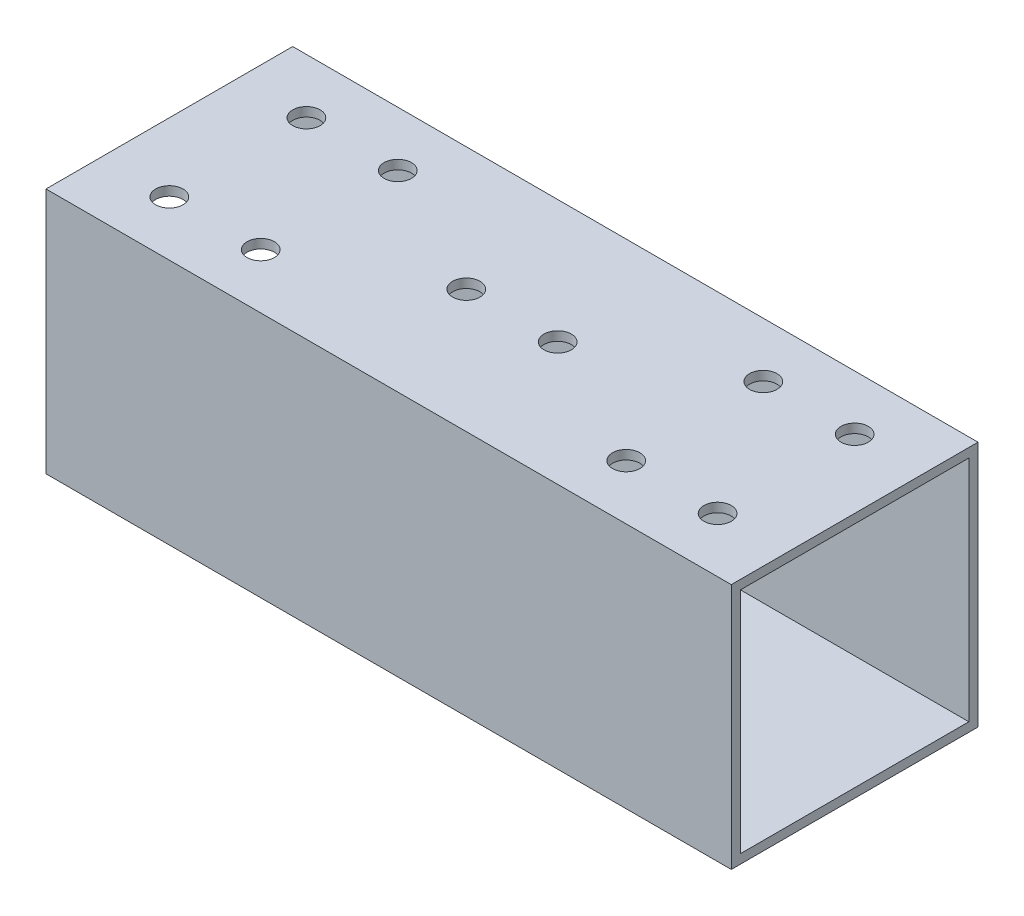
ISO-10303-21;
HEADER;
FILE_DESCRIPTION(('STEP AP214'),'2;1');
FILE_NAME('part.step','',(''),(''),'','','');
FILE_SCHEMA(('AUTOMOTIVE_DESIGN { 1 0 10303 214 1 1 1 1 }'));
ENDSEC;
DATA;
#1=APPLICATION_CONTEXT('core data for automotive mechanical design processes');
#2=APPLICATION_PROTOCOL_DEFINITION('international standard','automotive_design',2000,#1);
#3=PRODUCT_CONTEXT('',#1,'mechanical');
#4=PRODUCT('Part','Part','',(#3));
#5=PRODUCT_RELATED_PRODUCT_CATEGORY('part','',(#4));
#6=PRODUCT_DEFINITION_FORMATION('','',#4);
#7=PRODUCT_DEFINITION_CONTEXT('part definition',#1,'design');
#8=PRODUCT_DEFINITION('design','',#6,#7);
#9=PRODUCT_DEFINITION_SHAPE('','',#8);
#10=(LENGTH_UNIT() NAMED_UNIT(*) SI_UNIT(.MILLI.,.METRE.));
#11=(NAMED_UNIT(*) PLANE_ANGLE_UNIT() SI_UNIT($,.RADIAN.));
#12=(NAMED_UNIT(*) SI_UNIT($,.STERADIAN.) SOLID_ANGLE_UNIT());
#13=UNCERTAINTY_MEASURE_WITH_UNIT(LENGTH_MEASURE(1.E-05),#10,'distance_accuracy_value','');
#14=(GEOMETRIC_REPRESENTATION_CONTEXT(3) GLOBAL_UNCERTAINTY_ASSIGNED_CONTEXT((#13)) GLOBAL_UNIT_ASSIGNED_CONTEXT((#10,
#11,#12)) REPRESENTATION_CONTEXT('',''));
#15=CARTESIAN_POINT('',(0.,0.,0.));
#16=DIRECTION('',(0.,0.,1.));
#17=DIRECTION('',(1.,0.,0.));
#18=AXIS2_PLACEMENT_3D('',#15,#16,#17);
#19=CARTESIAN_POINT('',(75.,0.,0.));
#20=DIRECTION('',(1.,0.,0.));
#21=DIRECTION('',(0.,0.,-1.));
#22=AXIS2_PLACEMENT_3D('',#19,#20,#21);
#23=PLANE('',#22);
#24=DIRECTION('',(0.,-1.,0.));
#25=VECTOR('',#24,1.);
#26=CARTESIAN_POINT('',(75.,-27.,27.));
#27=LINE('',#26,#25);
#28=CARTESIAN_POINT('',(75.,27.,27.));
#29=VERTEX_POINT('',#28);
#30=CARTESIAN_POINT('',(75.,-27.,27.));
#31=VERTEX_POINT('',#30);
#32=EDGE_CURVE('E138',#29,#31,#27,.T.);
#33=ORIENTED_EDGE('',*,*,#32,.T.);
#34=DIRECTION('',(0.,0.,-1.));
#35=VECTOR('',#34,1.);
#36=CARTESIAN_POINT('',(75.,-27.,-27.));
#37=LINE('',#36,#35);
#38=CARTESIAN_POINT('',(75.,-27.,-27.));
#39=VERTEX_POINT('',#38);
#40=EDGE_CURVE('E141',#31,#39,#37,.T.);
#41=ORIENTED_EDGE('',*,*,#40,.T.);
#42=DIRECTION('',(0.,1.,0.));
#43=VECTOR('',#42,1.);
#44=CARTESIAN_POINT('',(75.,-27.,-27.));
#45=LINE('',#44,#43);
#46=CARTESIAN_POINT('',(75.,27.,-27.));
#47=VERTEX_POINT('',#46);
#48=EDGE_CURVE('E144',#39,#47,#45,.T.);
#49=ORIENTED_EDGE('',*,*,#48,.T.);
#50=DIRECTION('',(0.,0.,1.));
#51=VECTOR('',#50,1.);
#52=CARTESIAN_POINT('',(75.,27.,-27.));
#53=LINE('',#52,#51);
#54=EDGE_CURVE('E146',#47,#29,#53,.T.);
#55=ORIENTED_EDGE('',*,*,#54,.T.);
#56=EDGE_LOOP('',(#33,#41,#49,#55));
#57=FACE_BOUND('',#56,.T.);
#58=DIRECTION('',(0.,0.,1.));
#59=VECTOR('',#58,1.);
#60=CARTESIAN_POINT('',(75.,25.,25.));
#61=LINE('',#60,#59);
#62=CARTESIAN_POINT('',(75.,25.,-25.));
#63=VERTEX_POINT('',#62);
#64=CARTESIAN_POINT('',(75.,25.,25.));
#65=VERTEX_POINT('',#64);
#66=EDGE_CURVE('E108',#63,#65,#61,.T.);
#67=ORIENTED_EDGE('',*,*,#66,.F.);
#68=DIRECTION('',(0.,1.,0.));
#69=VECTOR('',#68,1.);
#70=CARTESIAN_POINT('',(75.,-25.,-25.));
#71=LINE('',#70,#69);
#72=CARTESIAN_POINT('',(75.,-25.,-25.));
#73=VERTEX_POINT('',#72);
#74=EDGE_CURVE('E100',#73,#63,#71,.T.);
#75=ORIENTED_EDGE('',*,*,#74,.F.);
#76=DIRECTION('',(0.,0.,-1.));
#77=VECTOR('',#76,1.);
#78=CARTESIAN_POINT('',(75.,-25.,25.));
#79=LINE('',#78,#77);
#80=CARTESIAN_POINT('',(75.,-25.,25.));
#81=VERTEX_POINT('',#80);
#82=EDGE_CURVE('E122',#81,#73,#79,.T.);
#83=ORIENTED_EDGE('',*,*,#82,.F.);
#84=DIRECTION('',(0.,-1.,0.));
#85=VECTOR('',#84,1.);
#86=CARTESIAN_POINT('',(75.,-25.,25.));
#87=LINE('',#86,#85);
#88=EDGE_CURVE('E120',#65,#81,#87,.T.);
#89=ORIENTED_EDGE('',*,*,#88,.F.);
#90=EDGE_LOOP('',(#67,#75,#83,#89));
#91=FACE_BOUND('',#90,.T.);
#92=ADVANCED_FACE('F33',(#57,#91),#23,.T.);
#93=CARTESIAN_POINT('',(-75.,0.,0.));
#94=DIRECTION('',(1.,0.,0.));
#95=DIRECTION('',(0.,0.,-1.));
#96=AXIS2_PLACEMENT_3D('',#93,#94,#95);
#97=PLANE('',#96);
#98=DIRECTION('',(0.,-1.,0.));
#99=VECTOR('',#98,1.);
#100=CARTESIAN_POINT('',(-75.,-27.,27.));
#101=LINE('',#100,#99);
#102=CARTESIAN_POINT('',(-75.,27.,27.));
#103=VERTEX_POINT('',#102);
#104=CARTESIAN_POINT('',(-75.,-27.,27.));
#105=VERTEX_POINT('',#104);
#106=EDGE_CURVE('E116',#103,#105,#101,.T.);
#107=ORIENTED_EDGE('',*,*,#106,.F.);
#108=DIRECTION('',(0.,0.,1.));
#109=VECTOR('',#108,1.);
#110=CARTESIAN_POINT('',(-75.,27.,-27.));
#111=LINE('',#110,#109);
#112=CARTESIAN_POINT('',(-75.,27.,-27.));
#113=VERTEX_POINT('',#112);
#114=EDGE_CURVE('E142',#113,#103,#111,.T.);
#115=ORIENTED_EDGE('',*,*,#114,.F.);
#116=DIRECTION('',(0.,1.,0.));
#117=VECTOR('',#116,1.);
#118=CARTESIAN_POINT('',(-75.,-27.,-27.));
#119=LINE('',#118,#117);
#120=CARTESIAN_POINT('',(-75.,-27.,-27.));
#121=VERTEX_POINT('',#120);
#122=EDGE_CURVE('E153',#121,#113,#119,.T.);
#123=ORIENTED_EDGE('',*,*,#122,.F.);
#124=DIRECTION('',(0.,0.,-1.));
#125=VECTOR('',#124,1.);
#126=CARTESIAN_POINT('',(-75.,-27.,-27.));
#127=LINE('',#126,#125);
#128=EDGE_CURVE('E151',#105,#121,#127,.T.);
#129=ORIENTED_EDGE('',*,*,#128,.F.);
#130=EDGE_LOOP('',(#107,#115,#123,#129));
#131=FACE_BOUND('',#130,.T.);
#132=DIRECTION('',(0.,1.,0.));
#133=VECTOR('',#132,1.);
#134=CARTESIAN_POINT('',(-75.,-25.,-25.));
#135=LINE('',#134,#133);
#136=CARTESIAN_POINT('',(-75.,-25.,-25.));
#137=VERTEX_POINT('',#136);
#138=CARTESIAN_POINT('',(-75.,25.,-25.));
#139=VERTEX_POINT('',#138);
#140=EDGE_CURVE('E58',#137,#139,#135,.T.);
#141=ORIENTED_EDGE('',*,*,#140,.T.);
#142=DIRECTION('',(0.,0.,1.));
#143=VECTOR('',#142,1.);
#144=CARTESIAN_POINT('',(-75.,25.,25.));
#145=LINE('',#144,#143);
#146=CARTESIAN_POINT('',(-75.,25.,25.));
#147=VERTEX_POINT('',#146);
#148=EDGE_CURVE('E115',#139,#147,#145,.T.);
#149=ORIENTED_EDGE('',*,*,#148,.T.);
#150=DIRECTION('',(0.,-1.,0.));
#151=VECTOR('',#150,1.);
#152=CARTESIAN_POINT('',(-75.,-25.,25.));
#153=LINE('',#152,#151);
#154=CARTESIAN_POINT('',(-75.,-25.,25.));
#155=VERTEX_POINT('',#154);
#156=EDGE_CURVE('E130',#147,#155,#153,.T.);
#157=ORIENTED_EDGE('',*,*,#156,.T.);
#158=DIRECTION('',(0.,0.,-1.));
#159=VECTOR('',#158,1.);
#160=CARTESIAN_POINT('',(-75.,-25.,25.));
#161=LINE('',#160,#159);
#162=EDGE_CURVE('E109',#155,#137,#161,.T.);
#163=ORIENTED_EDGE('',*,*,#162,.T.);
#164=EDGE_LOOP('',(#141,#149,#157,#163));
#165=FACE_BOUND('',#164,.T.);
#166=ADVANCED_FACE('F241',(#131,#165),#97,.F.);
#167=CARTESIAN_POINT('',(75.,-27.,27.));
#168=DIRECTION('',(0.,0.,-1.));
#169=DIRECTION('',(-1.,0.,0.));
#170=AXIS2_PLACEMENT_3D('',#167,#168,#169);
#171=PLANE('',#170);
#172=ORIENTED_EDGE('',*,*,#106,.T.);
#173=DIRECTION('',(-1.,0.,0.));
#174=VECTOR('',#173,1.);
#175=CARTESIAN_POINT('',(75.,-27.,27.));
#176=LINE('',#175,#174);
#177=EDGE_CURVE('E11',#31,#105,#176,.T.);
#178=ORIENTED_EDGE('',*,*,#177,.F.);
#179=ORIENTED_EDGE('',*,*,#32,.F.);
#180=DIRECTION('',(-1.,0.,0.));
#181=VECTOR('',#180,1.);
#182=CARTESIAN_POINT('',(75.,27.,27.));
#183=LINE('',#182,#181);
#184=EDGE_CURVE('E148',#29,#103,#183,.T.);
#185=ORIENTED_EDGE('',*,*,#184,.T.);
#186=EDGE_LOOP('',(#172,#178,#179,#185));
#187=FACE_BOUND('',#186,.T.);
#188=ADVANCED_FACE('F35',(#187),#171,.F.);
#189=CARTESIAN_POINT('',(75.,-27.,-27.));
#190=DIRECTION('',(0.,1.,0.));
#191=DIRECTION('',(0.,0.,1.));
#192=AXIS2_PLACEMENT_3D('',#189,#190,#191);
#193=PLANE('',#192);
#194=ORIENTED_EDGE('',*,*,#128,.T.);
#195=DIRECTION('',(-1.,0.,0.));
#196=VECTOR('',#195,1.);
#197=CARTESIAN_POINT('',(75.,-27.,-27.));
#198=LINE('',#197,#196);
#199=EDGE_CURVE('E42',#39,#121,#198,.T.);
#200=ORIENTED_EDGE('',*,*,#199,.F.);
#201=ORIENTED_EDGE('',*,*,#40,.F.);
#202=ORIENTED_EDGE('',*,*,#177,.T.);
#203=EDGE_LOOP('',(#194,#200,#201,#202));
#204=FACE_BOUND('',#203,.T.);
#205=ADVANCED_FACE('F245',(#204),#193,.F.);
#206=CARTESIAN_POINT('',(75.,-27.,-27.));
#207=DIRECTION('',(0.,0.,1.));
#208=DIRECTION('',(1.,0.,0.));
#209=AXIS2_PLACEMENT_3D('',#206,#207,#208);
#210=PLANE('',#209);
#211=ORIENTED_EDGE('',*,*,#122,.T.);
#212=DIRECTION('',(-1.,0.,0.));
#213=VECTOR('',#212,1.);
#214=CARTESIAN_POINT('',(75.,27.,-27.));
#215=LINE('',#214,#213);
#216=EDGE_CURVE('E158',#47,#113,#215,.T.);
#217=ORIENTED_EDGE('',*,*,#216,.F.);
#218=ORIENTED_EDGE('',*,*,#48,.F.);
#219=ORIENTED_EDGE('',*,*,#199,.T.);
#220=EDGE_LOOP('',(#211,#217,#218,#219));
#221=FACE_BOUND('',#220,.T.);
#222=ADVANCED_FACE('F228',(#221),#210,.F.);
#223=CARTESIAN_POINT('',(75.,27.,-27.));
#224=DIRECTION('',(0.,-1.,0.));
#225=DIRECTION('',(0.,0.,-1.));
#226=AXIS2_PLACEMENT_3D('',#223,#224,#225);
#227=PLANE('',#226);
#228=CARTESIAN_POINT('',(-10.,27.,0.));
#229=DIRECTION('',(0.,1.,0.));
#230=DIRECTION('',(0.,0.,1.));
#231=AXIS2_PLACEMENT_3D('',#228,#229,#230);
#232=CIRCLE('',#231,3.);
#233=CARTESIAN_POINT('',(-10.,27.,3.));
#234=VERTEX_POINT('',#233);
#235=EDGE_CURVE('E188',#234,#234,#232,.T.);
#236=ORIENTED_EDGE('',*,*,#235,.F.);
#237=EDGE_LOOP('',(#236));
#238=FACE_BOUND('',#237,.T.);
#239=CARTESIAN_POINT('',(10.,27.,0.));
#240=DIRECTION('',(0.,1.,0.));
#241=DIRECTION('',(0.,0.,1.));
#242=AXIS2_PLACEMENT_3D('',#239,#240,#241);
#243=CIRCLE('',#242,3.);
#244=CARTESIAN_POINT('',(10.,27.,3.));
#245=VERTEX_POINT('',#244);
#246=EDGE_CURVE('E194',#245,#245,#243,.T.);
#247=ORIENTED_EDGE('',*,*,#246,.F.);
#248=EDGE_LOOP('',(#247));
#249=FACE_BOUND('',#248,.T.);
#250=CARTESIAN_POINT('',(-40.,27.,15.));
#251=DIRECTION('',(0.,1.,0.));
#252=DIRECTION('',(0.,0.,1.));
#253=AXIS2_PLACEMENT_3D('',#250,#251,#252);
#254=CIRCLE('',#253,3.);
#255=CARTESIAN_POINT('',(-40.,27.,18.));
#256=VERTEX_POINT('',#255);
#257=EDGE_CURVE('E207',#256,#256,#254,.T.);
#258=ORIENTED_EDGE('',*,*,#257,.F.);
#259=EDGE_LOOP('',(#258));
#260=FACE_BOUND('',#259,.T.);
#261=CARTESIAN_POINT('',(60.,27.,15.));
#262=DIRECTION('',(0.,1.,0.));
#263=DIRECTION('',(0.,0.,1.));
#264=AXIS2_PLACEMENT_3D('',#261,#262,#263);
#265=CIRCLE('',#264,3.00000000000001);
#266=CARTESIAN_POINT('',(60.,27.,18.));
#267=VERTEX_POINT('',#266);
#268=EDGE_CURVE('E210',#267,#267,#265,.T.);
#269=ORIENTED_EDGE('',*,*,#268,.F.);
#270=EDGE_LOOP('',(#269));
#271=FACE_BOUND('',#270,.T.);
#272=CARTESIAN_POINT('',(60.,27.,-15.));
#273=DIRECTION('',(0.,1.,0.));
#274=DIRECTION('',(0.,0.,1.));
#275=AXIS2_PLACEMENT_3D('',#272,#273,#274);
#276=CIRCLE('',#275,3.00000000000001);
#277=CARTESIAN_POINT('',(60.,27.,-12.));
#278=VERTEX_POINT('',#277);
#279=EDGE_CURVE('E213',#278,#278,#276,.T.);
#280=ORIENTED_EDGE('',*,*,#279,.F.);
#281=EDGE_LOOP('',(#280));
#282=FACE_BOUND('',#281,.T.);
#283=CARTESIAN_POINT('',(-60.,27.,15.));
#284=DIRECTION('',(0.,1.,0.));
#285=DIRECTION('',(0.,0.,1.));
#286=AXIS2_PLACEMENT_3D('',#283,#284,#285);
#287=CIRCLE('',#286,3.);
#288=CARTESIAN_POINT('',(-60.,27.,18.));
#289=VERTEX_POINT('',#288);
#290=EDGE_CURVE('E216',#289,#289,#287,.T.);
#291=ORIENTED_EDGE('',*,*,#290,.F.);
#292=EDGE_LOOP('',(#291));
#293=FACE_BOUND('',#292,.T.);
#294=CARTESIAN_POINT('',(40.,27.,-15.));
#295=DIRECTION('',(0.,1.,0.));
#296=DIRECTION('',(0.,0.,-1.));
#297=AXIS2_PLACEMENT_3D('',#294,#295,#296);
#298=CIRCLE('',#297,3.);
#299=CARTESIAN_POINT('',(40.,27.,-18.));
#300=VERTEX_POINT('',#299);
#301=EDGE_CURVE('E192',#300,#300,#298,.T.);
#302=ORIENTED_EDGE('',*,*,#301,.F.);
#303=EDGE_LOOP('',(#302));
#304=FACE_BOUND('',#303,.T.);
#305=CARTESIAN_POINT('',(40.,27.,15.));
#306=DIRECTION('',(0.,1.,0.));
#307=DIRECTION('',(0.,0.,-1.));
#308=AXIS2_PLACEMENT_3D('',#305,#306,#307);
#309=CIRCLE('',#308,3.);
#310=CARTESIAN_POINT('',(40.,27.,12.));
#311=VERTEX_POINT('',#310);
#312=EDGE_CURVE('E203',#311,#311,#309,.T.);
#313=ORIENTED_EDGE('',*,*,#312,.F.);
#314=EDGE_LOOP('',(#313));
#315=FACE_BOUND('',#314,.T.);
#316=CARTESIAN_POINT('',(-40.,27.,-15.));
#317=DIRECTION('',(0.,1.,0.));
#318=DIRECTION('',(0.,0.,1.));
#319=AXIS2_PLACEMENT_3D('',#316,#317,#318);
#320=CIRCLE('',#319,3.);
#321=CARTESIAN_POINT('',(-40.,27.,-12.));
#322=VERTEX_POINT('',#321);
#323=EDGE_CURVE('E204',#322,#322,#320,.T.);
#324=ORIENTED_EDGE('',*,*,#323,.F.);
#325=EDGE_LOOP('',(#324));
#326=FACE_BOUND('',#325,.T.);
#327=CARTESIAN_POINT('',(-60.,27.,-15.));
#328=DIRECTION('',(0.,1.,0.));
#329=DIRECTION('',(0.,0.,1.));
#330=AXIS2_PLACEMENT_3D('',#327,#328,#329);
#331=CIRCLE('',#330,3.);
#332=CARTESIAN_POINT('',(-60.,27.,-12.));
#333=VERTEX_POINT('',#332);
#334=EDGE_CURVE('E167',#333,#333,#331,.T.);
#335=ORIENTED_EDGE('',*,*,#334,.F.);
#336=EDGE_LOOP('',(#335));
#337=FACE_BOUND('',#336,.T.);
#338=ORIENTED_EDGE('',*,*,#114,.T.);
#339=ORIENTED_EDGE('',*,*,#184,.F.);
#340=ORIENTED_EDGE('',*,*,#54,.F.);
#341=ORIENTED_EDGE('',*,*,#216,.T.);
#342=EDGE_LOOP('',(#338,#339,#340,#341));
#343=FACE_BOUND('',#342,.T.);
#344=ADVANCED_FACE('F225',(#238,#249,#260,#271,#282,#293,#304,#315,#326,#337,#343),#227,.F.);
#345=CARTESIAN_POINT('',(75.,-25.,-25.));
#346=DIRECTION('',(0.,0.,1.));
#347=DIRECTION('',(1.,0.,0.));
#348=AXIS2_PLACEMENT_3D('',#345,#346,#347);
#349=PLANE('',#348);
#350=ORIENTED_EDGE('',*,*,#140,.F.);
#351=DIRECTION('',(-1.,0.,0.));
#352=VECTOR('',#351,1.);
#353=CARTESIAN_POINT('',(75.,-25.,-25.));
#354=LINE('',#353,#352);
#355=EDGE_CURVE('E104',#73,#137,#354,.T.);
#356=ORIENTED_EDGE('',*,*,#355,.F.);
#357=ORIENTED_EDGE('',*,*,#74,.T.);
#358=DIRECTION('',(-1.,0.,0.));
#359=VECTOR('',#358,1.);
#360=CARTESIAN_POINT('',(75.,25.,-25.));
#361=LINE('',#360,#359);
#362=EDGE_CURVE('E103',#63,#139,#361,.T.);
#363=ORIENTED_EDGE('',*,*,#362,.T.);
#364=EDGE_LOOP('',(#350,#356,#357,#363));
#365=FACE_BOUND('',#364,.T.);
#366=ADVANCED_FACE('F102',(#365),#349,.T.);
#367=CARTESIAN_POINT('',(75.,25.,25.));
#368=DIRECTION('',(0.,-1.,0.));
#369=DIRECTION('',(0.,0.,-1.));
#370=AXIS2_PLACEMENT_3D('',#367,#368,#369);
#371=PLANE('',#370);
#372=CARTESIAN_POINT('',(-10.,25.,0.));
#373=DIRECTION('',(0.,-1.,0.));
#374=DIRECTION('',(0.,0.,-1.));
#375=AXIS2_PLACEMENT_3D('',#372,#373,#374);
#376=CIRCLE('',#375,3.);
#377=CARTESIAN_POINT('',(-10.,25.,-3.));
#378=VERTEX_POINT('',#377);
#379=EDGE_CURVE('E37',#378,#378,#376,.T.);
#380=ORIENTED_EDGE('',*,*,#379,.F.);
#381=EDGE_LOOP('',(#380));
#382=FACE_BOUND('',#381,.T.);
#383=CARTESIAN_POINT('',(10.,25.,0.));
#384=DIRECTION('',(0.,-1.,0.));
#385=DIRECTION('',(0.,0.,-1.));
#386=AXIS2_PLACEMENT_3D('',#383,#384,#385);
#387=CIRCLE('',#386,3.);
#388=CARTESIAN_POINT('',(10.,25.,-3.));
#389=VERTEX_POINT('',#388);
#390=EDGE_CURVE('E186',#389,#389,#387,.T.);
#391=ORIENTED_EDGE('',*,*,#390,.F.);
#392=EDGE_LOOP('',(#391));
#393=FACE_BOUND('',#392,.T.);
#394=CARTESIAN_POINT('',(-40.,25.,15.));
#395=DIRECTION('',(0.,-1.,0.));
#396=DIRECTION('',(0.,0.,-1.));
#397=AXIS2_PLACEMENT_3D('',#394,#395,#396);
#398=CIRCLE('',#397,3.);
#399=CARTESIAN_POINT('',(-40.,25.,12.));
#400=VERTEX_POINT('',#399);
#401=EDGE_CURVE('E128',#400,#400,#398,.T.);
#402=ORIENTED_EDGE('',*,*,#401,.F.);
#403=EDGE_LOOP('',(#402));
#404=FACE_BOUND('',#403,.T.);
#405=CARTESIAN_POINT('',(60.,25.,15.));
#406=DIRECTION('',(0.,-1.,0.));
#407=DIRECTION('',(0.,0.,-1.));
#408=AXIS2_PLACEMENT_3D('',#405,#406,#407);
#409=CIRCLE('',#408,3.00000000000001);
#410=CARTESIAN_POINT('',(60.,25.,12.));
#411=VERTEX_POINT('',#410);
#412=EDGE_CURVE('E182',#411,#411,#409,.T.);
#413=ORIENTED_EDGE('',*,*,#412,.F.);
#414=EDGE_LOOP('',(#413));
#415=FACE_BOUND('',#414,.T.);
#416=CARTESIAN_POINT('',(60.,25.,-15.));
#417=DIRECTION('',(0.,-1.,0.));
#418=DIRECTION('',(0.,0.,-1.));
#419=AXIS2_PLACEMENT_3D('',#416,#417,#418);
#420=CIRCLE('',#419,3.00000000000001);
#421=CARTESIAN_POINT('',(60.,25.,-18.));
#422=VERTEX_POINT('',#421);
#423=EDGE_CURVE('E179',#422,#422,#420,.T.);
#424=ORIENTED_EDGE('',*,*,#423,.F.);
#425=EDGE_LOOP('',(#424));
#426=FACE_BOUND('',#425,.T.);
#427=CARTESIAN_POINT('',(-60.,25.,15.));
#428=DIRECTION('',(0.,-1.,0.));
#429=DIRECTION('',(0.,0.,-1.));
#430=AXIS2_PLACEMENT_3D('',#427,#428,#429);
#431=CIRCLE('',#430,3.);
#432=CARTESIAN_POINT('',(-60.,25.,12.));
#433=VERTEX_POINT('',#432);
#434=EDGE_CURVE('E176',#433,#433,#431,.T.);
#435=ORIENTED_EDGE('',*,*,#434,.F.);
#436=EDGE_LOOP('',(#435));
#437=FACE_BOUND('',#436,.T.);
#438=CARTESIAN_POINT('',(40.,25.,-15.));
#439=DIRECTION('',(0.,-1.,0.));
#440=DIRECTION('',(0.,0.,-1.));
#441=AXIS2_PLACEMENT_3D('',#438,#439,#440);
#442=CIRCLE('',#441,3.);
#443=CARTESIAN_POINT('',(40.,25.,-18.));
#444=VERTEX_POINT('',#443);
#445=EDGE_CURVE('E173',#444,#444,#442,.T.);
#446=ORIENTED_EDGE('',*,*,#445,.F.);
#447=EDGE_LOOP('',(#446));
#448=FACE_BOUND('',#447,.T.);
#449=CARTESIAN_POINT('',(40.,25.,15.));
#450=DIRECTION('',(0.,-1.,0.));
#451=DIRECTION('',(0.,0.,-1.));
#452=AXIS2_PLACEMENT_3D('',#449,#450,#451);
#453=CIRCLE('',#452,3.);
#454=CARTESIAN_POINT('',(40.,25.,12.));
#455=VERTEX_POINT('',#454);
#456=EDGE_CURVE('E170',#455,#455,#453,.T.);
#457=ORIENTED_EDGE('',*,*,#456,.F.);
#458=EDGE_LOOP('',(#457));
#459=FACE_BOUND('',#458,.T.);
#460=CARTESIAN_POINT('',(-40.,25.,-15.));
#461=DIRECTION('',(0.,-1.,0.));
#462=DIRECTION('',(0.,0.,-1.));
#463=AXIS2_PLACEMENT_3D('',#460,#461,#462);
#464=CIRCLE('',#463,3.);
#465=CARTESIAN_POINT('',(-40.,25.,-18.));
#466=VERTEX_POINT('',#465);
#467=EDGE_CURVE('E166',#466,#466,#464,.T.);
#468=ORIENTED_EDGE('',*,*,#467,.F.);
#469=EDGE_LOOP('',(#468));
#470=FACE_BOUND('',#469,.T.);
#471=CARTESIAN_POINT('',(-60.,25.,-15.));
#472=DIRECTION('',(0.,-1.,0.));
#473=DIRECTION('',(0.,0.,-1.));
#474=AXIS2_PLACEMENT_3D('',#471,#472,#473);
#475=CIRCLE('',#474,3.);
#476=CARTESIAN_POINT('',(-60.,25.,-18.));
#477=VERTEX_POINT('',#476);
#478=EDGE_CURVE('E163',#477,#477,#475,.T.);
#479=ORIENTED_EDGE('',*,*,#478,.F.);
#480=EDGE_LOOP('',(#479));
#481=FACE_BOUND('',#480,.T.);
#482=ORIENTED_EDGE('',*,*,#148,.F.);
#483=ORIENTED_EDGE('',*,*,#362,.F.);
#484=ORIENTED_EDGE('',*,*,#66,.T.);
#485=DIRECTION('',(-1.,0.,0.));
#486=VECTOR('',#485,1.);
#487=CARTESIAN_POINT('',(75.,25.,25.));
#488=LINE('',#487,#486);
#489=EDGE_CURVE('E117',#65,#147,#488,.T.);
#490=ORIENTED_EDGE('',*,*,#489,.T.);
#491=EDGE_LOOP('',(#482,#483,#484,#490));
#492=FACE_BOUND('',#491,.T.);
#493=ADVANCED_FACE('F112',(#382,#393,#404,#415,#426,#437,#448,#459,#470,#481,#492),#371,.T.);
#494=CARTESIAN_POINT('',(75.,-25.,25.));
#495=DIRECTION('',(0.,0.,-1.));
#496=DIRECTION('',(-1.,0.,0.));
#497=AXIS2_PLACEMENT_3D('',#494,#495,#496);
#498=PLANE('',#497);
#499=ORIENTED_EDGE('',*,*,#156,.F.);
#500=ORIENTED_EDGE('',*,*,#489,.F.);
#501=ORIENTED_EDGE('',*,*,#88,.T.);
#502=DIRECTION('',(-1.,0.,0.));
#503=VECTOR('',#502,1.);
#504=CARTESIAN_POINT('',(75.,-25.,25.));
#505=LINE('',#504,#503);
#506=EDGE_CURVE('E50',#81,#155,#505,.T.);
#507=ORIENTED_EDGE('',*,*,#506,.T.);
#508=EDGE_LOOP('',(#499,#500,#501,#507));
#509=FACE_BOUND('',#508,.T.);
#510=ADVANCED_FACE('F265',(#509),#498,.T.);
#511=CARTESIAN_POINT('',(75.,-25.,25.));
#512=DIRECTION('',(0.,1.,0.));
#513=DIRECTION('',(0.,0.,1.));
#514=AXIS2_PLACEMENT_3D('',#511,#512,#513);
#515=PLANE('',#514);
#516=ORIENTED_EDGE('',*,*,#162,.F.);
#517=ORIENTED_EDGE('',*,*,#506,.F.);
#518=ORIENTED_EDGE('',*,*,#82,.T.);
#519=ORIENTED_EDGE('',*,*,#355,.T.);
#520=EDGE_LOOP('',(#516,#517,#518,#519));
#521=FACE_BOUND('',#520,.T.);
#522=ADVANCED_FACE('F269',(#521),#515,.T.);
#523=CARTESIAN_POINT('',(-60.,2.,-15.));
#524=DIRECTION('',(0.,1.,0.));
#525=DIRECTION('',(0.,0.,1.));
#526=AXIS2_PLACEMENT_3D('',#523,#524,#525);
#527=CYLINDRICAL_SURFACE('',#526,3.);
#528=ORIENTED_EDGE('',*,*,#478,.T.);
#529=EDGE_LOOP('',(#528));
#530=FACE_BOUND('',#529,.T.);
#531=ORIENTED_EDGE('',*,*,#334,.T.);
#532=EDGE_LOOP('',(#531));
#533=FACE_BOUND('',#532,.T.);
#534=ADVANCED_FACE('F223',(#530,#533),#527,.F.);
#535=CARTESIAN_POINT('',(-40.,2.,-15.));
#536=DIRECTION('',(0.,1.,0.));
#537=DIRECTION('',(0.,0.,1.));
#538=AXIS2_PLACEMENT_3D('',#535,#536,#537);
#539=CYLINDRICAL_SURFACE('',#538,3.);
#540=ORIENTED_EDGE('',*,*,#467,.T.);
#541=EDGE_LOOP('',(#540));
#542=FACE_BOUND('',#541,.T.);
#543=ORIENTED_EDGE('',*,*,#323,.T.);
#544=EDGE_LOOP('',(#543));
#545=FACE_BOUND('',#544,.T.);
#546=ADVANCED_FACE('F275',(#542,#545),#539,.F.);
#547=CARTESIAN_POINT('',(40.,1.99999999999999,15.));
#548=DIRECTION('',(0.,1.,0.));
#549=DIRECTION('',(0.,0.,1.));
#550=AXIS2_PLACEMENT_3D('',#547,#548,#549);
#551=CYLINDRICAL_SURFACE('',#550,3.);
#552=ORIENTED_EDGE('',*,*,#456,.T.);
#553=EDGE_LOOP('',(#552));
#554=FACE_BOUND('',#553,.T.);
#555=ORIENTED_EDGE('',*,*,#312,.T.);
#556=EDGE_LOOP('',(#555));
#557=FACE_BOUND('',#556,.T.);
#558=ADVANCED_FACE('F295',(#554,#557),#551,.F.);
#559=CARTESIAN_POINT('',(40.,2.,-15.));
#560=DIRECTION('',(0.,1.,0.));
#561=DIRECTION('',(0.,0.,1.));
#562=AXIS2_PLACEMENT_3D('',#559,#560,#561);
#563=CYLINDRICAL_SURFACE('',#562,3.);
#564=ORIENTED_EDGE('',*,*,#445,.T.);
#565=EDGE_LOOP('',(#564));
#566=FACE_BOUND('',#565,.T.);
#567=ORIENTED_EDGE('',*,*,#301,.T.);
#568=EDGE_LOOP('',(#567));
#569=FACE_BOUND('',#568,.T.);
#570=ADVANCED_FACE('F285',(#566,#569),#563,.F.);
#571=CARTESIAN_POINT('',(-60.,1.99999999999999,15.));
#572=DIRECTION('',(0.,1.,0.));
#573=DIRECTION('',(0.,0.,1.));
#574=AXIS2_PLACEMENT_3D('',#571,#572,#573);
#575=CYLINDRICAL_SURFACE('',#574,3.);
#576=ORIENTED_EDGE('',*,*,#434,.T.);
#577=EDGE_LOOP('',(#576));
#578=FACE_BOUND('',#577,.T.);
#579=ORIENTED_EDGE('',*,*,#290,.T.);
#580=EDGE_LOOP('',(#579));
#581=FACE_BOUND('',#580,.T.);
#582=ADVANCED_FACE('F281',(#578,#581),#575,.F.);
#583=CARTESIAN_POINT('',(60.,2.,-15.));
#584=DIRECTION('',(0.,1.,0.));
#585=DIRECTION('',(0.,0.,1.));
#586=AXIS2_PLACEMENT_3D('',#583,#584,#585);
#587=CYLINDRICAL_SURFACE('',#586,3.00000000000001);
#588=ORIENTED_EDGE('',*,*,#423,.T.);
#589=EDGE_LOOP('',(#588));
#590=FACE_BOUND('',#589,.T.);
#591=ORIENTED_EDGE('',*,*,#279,.T.);
#592=EDGE_LOOP('',(#591));
#593=FACE_BOUND('',#592,.T.);
#594=ADVANCED_FACE('F277',(#590,#593),#587,.F.);
#595=CARTESIAN_POINT('',(60.,1.99999999999999,15.));
#596=DIRECTION('',(0.,1.,0.));
#597=DIRECTION('',(0.,0.,1.));
#598=AXIS2_PLACEMENT_3D('',#595,#596,#597);
#599=CYLINDRICAL_SURFACE('',#598,3.00000000000001);
#600=ORIENTED_EDGE('',*,*,#412,.T.);
#601=EDGE_LOOP('',(#600));
#602=FACE_BOUND('',#601,.T.);
#603=ORIENTED_EDGE('',*,*,#268,.T.);
#604=EDGE_LOOP('',(#603));
#605=FACE_BOUND('',#604,.T.);
#606=ADVANCED_FACE('F280',(#602,#605),#599,.F.);
#607=CARTESIAN_POINT('',(-40.,1.99999999999999,15.));
#608=DIRECTION('',(0.,1.,0.));
#609=DIRECTION('',(0.,0.,1.));
#610=AXIS2_PLACEMENT_3D('',#607,#608,#609);
#611=CYLINDRICAL_SURFACE('',#610,3.);
#612=ORIENTED_EDGE('',*,*,#401,.T.);
#613=EDGE_LOOP('',(#612));
#614=FACE_BOUND('',#613,.T.);
#615=ORIENTED_EDGE('',*,*,#257,.T.);
#616=EDGE_LOOP('',(#615));
#617=FACE_BOUND('',#616,.T.);
#618=ADVANCED_FACE('F287',(#614,#617),#611,.F.);
#619=CARTESIAN_POINT('',(10.,2.,0.));
#620=DIRECTION('',(0.,1.,0.));
#621=DIRECTION('',(0.,0.,1.));
#622=AXIS2_PLACEMENT_3D('',#619,#620,#621);
#623=CYLINDRICAL_SURFACE('',#622,3.);
#624=ORIENTED_EDGE('',*,*,#390,.T.);
#625=EDGE_LOOP('',(#624));
#626=FACE_BOUND('',#625,.T.);
#627=ORIENTED_EDGE('',*,*,#246,.T.);
#628=EDGE_LOOP('',(#627));
#629=FACE_BOUND('',#628,.T.);
#630=ADVANCED_FACE('F290',(#626,#629),#623,.F.);
#631=CARTESIAN_POINT('',(-10.,2.,0.));
#632=DIRECTION('',(0.,1.,0.));
#633=DIRECTION('',(0.,0.,1.));
#634=AXIS2_PLACEMENT_3D('',#631,#632,#633);
#635=CYLINDRICAL_SURFACE('',#634,3.);
#636=ORIENTED_EDGE('',*,*,#379,.T.);
#637=EDGE_LOOP('',(#636));
#638=FACE_BOUND('',#637,.T.);
#639=ORIENTED_EDGE('',*,*,#235,.T.);
#640=EDGE_LOOP('',(#639));
#641=FACE_BOUND('',#640,.T.);
#642=ADVANCED_FACE('F307',(#638,#641),#635,.F.);
#643=CLOSED_SHELL('',(#92,#166,#188,#205,#222,#344,#366,#493,#510,#522,#534,#546,#558,#570,#582,
#594,#606,#618,#630,#642));
#644=MANIFOLD_SOLID_BREP('B2',#643);
#645=ADVANCED_BREP_SHAPE_REPRESENTATION('',(#18,#644),#14);
#646=SHAPE_DEFINITION_REPRESENTATION(#9,#645);
ENDSEC;
END-ISO-10303-21;
